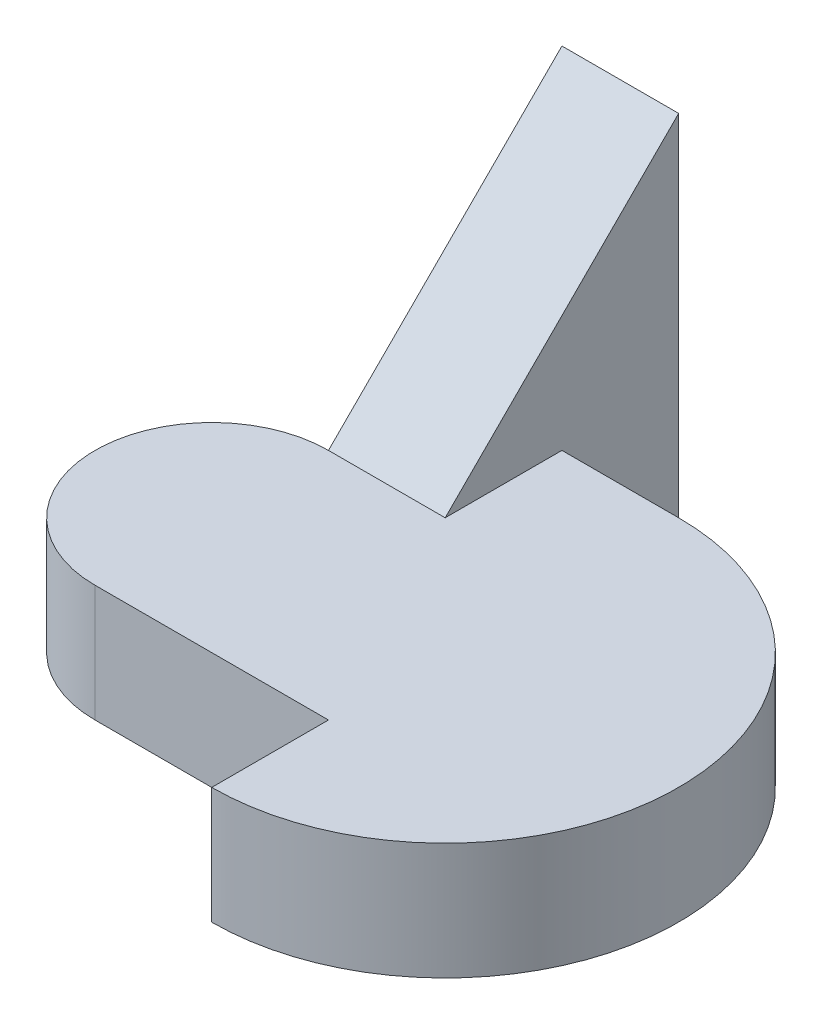
ISO-10303-21;
HEADER;
FILE_DESCRIPTION(('STEP AP214'),'2;1');
FILE_NAME('part.step','',(''),(''),'','','');
FILE_SCHEMA(('AUTOMOTIVE_DESIGN { 1 0 10303 214 1 1 1 1 }'));
ENDSEC;
DATA;
#1=APPLICATION_CONTEXT('core data for automotive mechanical design processes');
#2=APPLICATION_PROTOCOL_DEFINITION('international standard','automotive_design',2000,#1);
#3=PRODUCT_CONTEXT('',#1,'mechanical');
#4=PRODUCT('Part','Part','',(#3));
#5=PRODUCT_RELATED_PRODUCT_CATEGORY('part','',(#4));
#6=PRODUCT_DEFINITION_FORMATION('','',#4);
#7=PRODUCT_DEFINITION_CONTEXT('part definition',#1,'design');
#8=PRODUCT_DEFINITION('design','',#6,#7);
#9=PRODUCT_DEFINITION_SHAPE('','',#8);
#10=(LENGTH_UNIT() NAMED_UNIT(*) SI_UNIT(.MILLI.,.METRE.));
#11=(NAMED_UNIT(*) PLANE_ANGLE_UNIT() SI_UNIT($,.RADIAN.));
#12=(NAMED_UNIT(*) SI_UNIT($,.STERADIAN.) SOLID_ANGLE_UNIT());
#13=UNCERTAINTY_MEASURE_WITH_UNIT(LENGTH_MEASURE(1.E-05),#10,'distance_accuracy_value','');
#14=(GEOMETRIC_REPRESENTATION_CONTEXT(3) GLOBAL_UNCERTAINTY_ASSIGNED_CONTEXT((#13)) GLOBAL_UNIT_ASSIGNED_CONTEXT((#10,
#11,#12)) REPRESENTATION_CONTEXT('',''));
#15=CARTESIAN_POINT('',(0.,0.,0.));
#16=DIRECTION('',(0.,0.,1.));
#17=DIRECTION('',(1.,0.,0.));
#18=AXIS2_PLACEMENT_3D('',#15,#16,#17);
#19=CARTESIAN_POINT('',(-20.,10.,0.));
#20=DIRECTION('',(0.,-1.,0.));
#21=DIRECTION('',(0.,0.,-1.));
#22=AXIS2_PLACEMENT_3D('',#19,#20,#21);
#23=CYLINDRICAL_SURFACE('',#22,10.);
#24=CARTESIAN_POINT('',(-20.,0.,0.));
#25=DIRECTION('',(0.,1.,0.));
#26=DIRECTION('',(0.,0.,1.));
#27=AXIS2_PLACEMENT_3D('',#24,#25,#26);
#28=CIRCLE('',#27,10.);
#29=CARTESIAN_POINT('',(-20.,0.,-10.));
#30=VERTEX_POINT('',#29);
#31=CARTESIAN_POINT('',(-20.,0.,10.));
#32=VERTEX_POINT('',#31);
#33=EDGE_CURVE('E130',#30,#32,#28,.T.);
#34=ORIENTED_EDGE('',*,*,#33,.T.);
#35=DIRECTION('',(0.,-1.,0.));
#36=VECTOR('',#35,1.);
#37=CARTESIAN_POINT('',(-20.,10.,10.));
#38=LINE('',#37,#36);
#39=CARTESIAN_POINT('',(-20.,10.,10.));
#40=VERTEX_POINT('',#39);
#41=EDGE_CURVE('E48',#40,#32,#38,.T.);
#42=ORIENTED_EDGE('',*,*,#41,.F.);
#43=CARTESIAN_POINT('',(-20.,10.,0.));
#44=DIRECTION('',(0.,1.,0.));
#45=DIRECTION('',(0.,0.,1.));
#46=AXIS2_PLACEMENT_3D('',#43,#44,#45);
#47=CIRCLE('',#46,10.);
#48=CARTESIAN_POINT('',(-20.,10.,-10.));
#49=VERTEX_POINT('',#48);
#50=EDGE_CURVE('E95',#49,#40,#47,.T.);
#51=ORIENTED_EDGE('',*,*,#50,.F.);
#52=DIRECTION('',(0.,-1.,0.));
#53=VECTOR('',#52,1.);
#54=CARTESIAN_POINT('',(-20.,10.,-10.));
#55=LINE('',#54,#53);
#56=EDGE_CURVE('E11',#49,#30,#55,.T.);
#57=ORIENTED_EDGE('',*,*,#56,.T.);
#58=EDGE_LOOP('',(#34,#42,#51,#57));
#59=FACE_BOUND('',#58,.T.);
#60=ADVANCED_FACE('F39',(#59),#23,.T.);
#61=CARTESIAN_POINT('',(-20.,10.,10.));
#62=DIRECTION('',(0.,0.,-1.));
#63=DIRECTION('',(-1.,0.,0.));
#64=AXIS2_PLACEMENT_3D('',#61,#62,#63);
#65=PLANE('',#64);
#66=DIRECTION('',(1.,0.,0.));
#67=VECTOR('',#66,1.);
#68=CARTESIAN_POINT('',(-20.,0.,10.));
#69=LINE('',#68,#67);
#70=CARTESIAN_POINT('',(0.,0.,10.));
#71=VERTEX_POINT('',#70);
#72=EDGE_CURVE('E133',#32,#71,#69,.T.);
#73=ORIENTED_EDGE('',*,*,#72,.T.);
#74=DIRECTION('',(0.,-1.,0.));
#75=VECTOR('',#74,1.);
#76=CARTESIAN_POINT('',(0.,10.,10.));
#77=LINE('',#76,#75);
#78=CARTESIAN_POINT('',(0.,10.,10.));
#79=VERTEX_POINT('',#78);
#80=EDGE_CURVE('E149',#79,#71,#77,.T.);
#81=ORIENTED_EDGE('',*,*,#80,.F.);
#82=DIRECTION('',(1.,0.,0.));
#83=VECTOR('',#82,1.);
#84=CARTESIAN_POINT('',(-20.,10.,10.));
#85=LINE('',#84,#83);
#86=EDGE_CURVE('E159',#40,#79,#85,.T.);
#87=ORIENTED_EDGE('',*,*,#86,.F.);
#88=ORIENTED_EDGE('',*,*,#41,.T.);
#89=EDGE_LOOP('',(#73,#81,#87,#88));
#90=FACE_BOUND('',#89,.T.);
#91=ADVANCED_FACE('F157',(#90),#65,.F.);
#92=CARTESIAN_POINT('',(0.,10.,10.));
#93=DIRECTION('',(1.,0.,0.));
#94=DIRECTION('',(0.,0.,-1.));
#95=AXIS2_PLACEMENT_3D('',#92,#93,#94);
#96=PLANE('',#95);
#97=DIRECTION('',(0.,0.,1.));
#98=VECTOR('',#97,1.);
#99=CARTESIAN_POINT('',(0.,0.,10.));
#100=LINE('',#99,#98);
#101=CARTESIAN_POINT('',(0.,0.,20.));
#102=VERTEX_POINT('',#101);
#103=EDGE_CURVE('E137',#71,#102,#100,.T.);
#104=ORIENTED_EDGE('',*,*,#103,.T.);
#105=DIRECTION('',(0.,-1.,0.));
#106=VECTOR('',#105,1.);
#107=CARTESIAN_POINT('',(0.,10.,20.));
#108=LINE('',#107,#106);
#109=CARTESIAN_POINT('',(0.,10.,20.));
#110=VERTEX_POINT('',#109);
#111=EDGE_CURVE('E120',#110,#102,#108,.T.);
#112=ORIENTED_EDGE('',*,*,#111,.F.);
#113=DIRECTION('',(0.,0.,1.));
#114=VECTOR('',#113,1.);
#115=CARTESIAN_POINT('',(0.,10.,10.));
#116=LINE('',#115,#114);
#117=EDGE_CURVE('E113',#79,#110,#116,.T.);
#118=ORIENTED_EDGE('',*,*,#117,.F.);
#119=ORIENTED_EDGE('',*,*,#80,.T.);
#120=EDGE_LOOP('',(#104,#112,#118,#119));
#121=FACE_BOUND('',#120,.T.);
#122=ADVANCED_FACE('F165',(#121),#96,.F.);
#123=CARTESIAN_POINT('',(0.,10.,0.));
#124=DIRECTION('',(0.,-1.,0.));
#125=DIRECTION('',(0.,0.,-1.));
#126=AXIS2_PLACEMENT_3D('',#123,#124,#125);
#127=CYLINDRICAL_SURFACE('',#126,20.);
#128=CARTESIAN_POINT('',(0.,0.,0.));
#129=DIRECTION('',(0.,1.,0.));
#130=DIRECTION('',(0.,0.,1.));
#131=AXIS2_PLACEMENT_3D('',#128,#129,#130);
#132=CIRCLE('',#131,20.);
#133=CARTESIAN_POINT('',(0.,0.,-20.));
#134=VERTEX_POINT('',#133);
#135=EDGE_CURVE('E80',#102,#134,#132,.T.);
#136=ORIENTED_EDGE('',*,*,#135,.T.);
#137=DIRECTION('',(0.,-1.,0.));
#138=VECTOR('',#137,1.);
#139=CARTESIAN_POINT('',(0.,10.,-20.));
#140=LINE('',#139,#138);
#141=CARTESIAN_POINT('',(0.,10.,-20.));
#142=VERTEX_POINT('',#141);
#143=EDGE_CURVE('E117',#142,#134,#140,.T.);
#144=ORIENTED_EDGE('',*,*,#143,.F.);
#145=CARTESIAN_POINT('',(0.,10.,0.));
#146=DIRECTION('',(0.,1.,0.));
#147=DIRECTION('',(0.,0.,1.));
#148=AXIS2_PLACEMENT_3D('',#145,#146,#147);
#149=CIRCLE('',#148,20.);
#150=EDGE_CURVE('E108',#110,#142,#149,.T.);
#151=ORIENTED_EDGE('',*,*,#150,.F.);
#152=ORIENTED_EDGE('',*,*,#111,.T.);
#153=EDGE_LOOP('',(#136,#144,#151,#152));
#154=FACE_BOUND('',#153,.T.);
#155=ADVANCED_FACE('F118',(#154),#127,.T.);
#156=CARTESIAN_POINT('',(0.,10.,-20.));
#157=DIRECTION('',(0.,0.,1.));
#158=DIRECTION('',(1.,0.,0.));
#159=AXIS2_PLACEMENT_3D('',#156,#157,#158);
#160=PLANE('',#159);
#161=DIRECTION('',(-1.,0.,0.));
#162=VECTOR('',#161,1.);
#163=CARTESIAN_POINT('',(0.,0.,-20.));
#164=LINE('',#163,#162);
#165=CARTESIAN_POINT('',(-10.,0.,-20.));
#166=VERTEX_POINT('',#165);
#167=EDGE_CURVE('E87',#134,#166,#164,.T.);
#168=ORIENTED_EDGE('',*,*,#167,.T.);
#169=DIRECTION('',(0.,-1.,0.));
#170=VECTOR('',#169,1.);
#171=CARTESIAN_POINT('',(-10.,10.,-20.));
#172=LINE('',#171,#170);
#173=CARTESIAN_POINT('',(-10.,10.,-20.));
#174=VERTEX_POINT('',#173);
#175=EDGE_CURVE('E121',#174,#166,#172,.T.);
#176=ORIENTED_EDGE('',*,*,#175,.F.);
#177=DIRECTION('',(-1.,0.,0.));
#178=VECTOR('',#177,1.);
#179=CARTESIAN_POINT('',(0.,10.,-20.));
#180=LINE('',#179,#178);
#181=EDGE_CURVE('E111',#142,#174,#180,.T.);
#182=ORIENTED_EDGE('',*,*,#181,.F.);
#183=ORIENTED_EDGE('',*,*,#143,.T.);
#184=EDGE_LOOP('',(#168,#176,#182,#183));
#185=FACE_BOUND('',#184,.T.);
#186=ADVANCED_FACE('F123',(#185),#160,.F.);
#187=CARTESIAN_POINT('',(-20.,10.,0.));
#188=DIRECTION('',(0.,1.,0.));
#189=DIRECTION('',(0.,0.,1.));
#190=AXIS2_PLACEMENT_3D('',#187,#188,#189);
#191=PLANE('',#190);
#192=DIRECTION('',(-1.,0.,0.));
#193=VECTOR('',#192,1.);
#194=CARTESIAN_POINT('',(-10.,10.,-10.));
#195=LINE('',#194,#193);
#196=CARTESIAN_POINT('',(-10.,10.,-10.));
#197=VERTEX_POINT('',#196);
#198=EDGE_CURVE('E144',#197,#49,#195,.T.);
#199=ORIENTED_EDGE('',*,*,#198,.T.);
#200=ORIENTED_EDGE('',*,*,#50,.T.);
#201=ORIENTED_EDGE('',*,*,#86,.T.);
#202=ORIENTED_EDGE('',*,*,#117,.T.);
#203=ORIENTED_EDGE('',*,*,#150,.T.);
#204=ORIENTED_EDGE('',*,*,#181,.T.);
#205=DIRECTION('',(0.,0.,1.));
#206=VECTOR('',#205,1.);
#207=CARTESIAN_POINT('',(-10.,10.,-20.));
#208=LINE('',#207,#206);
#209=EDGE_CURVE('E56',#174,#197,#208,.T.);
#210=ORIENTED_EDGE('',*,*,#209,.T.);
#211=EDGE_LOOP('',(#199,#200,#201,#202,#203,#204,#210));
#212=FACE_BOUND('',#211,.T.);
#213=ADVANCED_FACE('F109',(#212),#191,.T.);
#214=CARTESIAN_POINT('',(-20.,0.,0.));
#215=DIRECTION('',(0.,1.,0.));
#216=DIRECTION('',(0.,0.,1.));
#217=AXIS2_PLACEMENT_3D('',#214,#215,#216);
#218=PLANE('',#217);
#219=ORIENTED_EDGE('',*,*,#33,.F.);
#220=DIRECTION('',(0.,0.,1.));
#221=VECTOR('',#220,1.);
#222=CARTESIAN_POINT('',(-20.,0.,-30.));
#223=LINE('',#222,#221);
#224=CARTESIAN_POINT('',(-20.,0.,-30.));
#225=VERTEX_POINT('',#224);
#226=EDGE_CURVE('E181',#225,#30,#223,.T.);
#227=ORIENTED_EDGE('',*,*,#226,.F.);
#228=DIRECTION('',(1.,0.,0.));
#229=VECTOR('',#228,1.);
#230=CARTESIAN_POINT('',(-20.,0.,-30.));
#231=LINE('',#230,#229);
#232=CARTESIAN_POINT('',(-10.,0.,-30.));
#233=VERTEX_POINT('',#232);
#234=EDGE_CURVE('E177',#225,#233,#231,.T.);
#235=ORIENTED_EDGE('',*,*,#234,.T.);
#236=DIRECTION('',(0.,0.,1.));
#237=VECTOR('',#236,1.);
#238=CARTESIAN_POINT('',(-10.,0.,-30.));
#239=LINE('',#238,#237);
#240=EDGE_CURVE('E182',#233,#166,#239,.T.);
#241=ORIENTED_EDGE('',*,*,#240,.T.);
#242=ORIENTED_EDGE('',*,*,#167,.F.);
#243=ORIENTED_EDGE('',*,*,#135,.F.);
#244=ORIENTED_EDGE('',*,*,#103,.F.);
#245=ORIENTED_EDGE('',*,*,#72,.F.);
#246=EDGE_LOOP('',(#219,#227,#235,#241,#242,#243,#244,#245));
#247=FACE_BOUND('',#246,.T.);
#248=ADVANCED_FACE('F162',(#247),#218,.F.);
#249=CARTESIAN_POINT('',(-9.99999999999999,0.,0.));
#250=DIRECTION('',(-1.,0.,0.));
#251=DIRECTION('',(0.,0.,1.));
#252=AXIS2_PLACEMENT_3D('',#249,#250,#251);
#253=PLANE('',#252);
#254=ORIENTED_EDGE('',*,*,#209,.F.);
#255=ORIENTED_EDGE('',*,*,#175,.T.);
#256=ORIENTED_EDGE('',*,*,#240,.F.);
#257=DIRECTION('',(0.,-1.,0.));
#258=VECTOR('',#257,1.);
#259=CARTESIAN_POINT('',(-10.,30.,-30.));
#260=LINE('',#259,#258);
#261=CARTESIAN_POINT('',(-10.,30.,-30.));
#262=VERTEX_POINT('',#261);
#263=EDGE_CURVE('E187',#262,#233,#260,.T.);
#264=ORIENTED_EDGE('',*,*,#263,.F.);
#265=DIRECTION('',(0.,0.707106781186547,-0.707106781186548));
#266=VECTOR('',#265,1.);
#267=CARTESIAN_POINT('',(-10.,10.,-10.));
#268=LINE('',#267,#266);
#269=EDGE_CURVE('E191',#197,#262,#268,.T.);
#270=ORIENTED_EDGE('',*,*,#269,.F.);
#271=EDGE_LOOP('',(#254,#255,#256,#264,#270));
#272=FACE_BOUND('',#271,.T.);
#273=ADVANCED_FACE('F223',(#272),#253,.F.);
#274=CARTESIAN_POINT('',(-20.,10.,-10.));
#275=DIRECTION('',(0.,-0.707106781186548,-0.707106781186547));
#276=DIRECTION('',(0.,0.707106781186547,-0.707106781186548));
#277=AXIS2_PLACEMENT_3D('',#274,#275,#276);
#278=PLANE('',#277);
#279=ORIENTED_EDGE('',*,*,#269,.T.);
#280=DIRECTION('',(1.,0.,0.));
#281=VECTOR('',#280,1.);
#282=CARTESIAN_POINT('',(-20.,30.,-30.));
#283=LINE('',#282,#281);
#284=CARTESIAN_POINT('',(-20.,30.,-30.));
#285=VERTEX_POINT('',#284);
#286=EDGE_CURVE('E134',#285,#262,#283,.T.);
#287=ORIENTED_EDGE('',*,*,#286,.F.);
#288=DIRECTION('',(0.,0.707106781186547,-0.707106781186548));
#289=VECTOR('',#288,1.);
#290=CARTESIAN_POINT('',(-20.,10.,-10.));
#291=LINE('',#290,#289);
#292=EDGE_CURVE('E186',#49,#285,#291,.T.);
#293=ORIENTED_EDGE('',*,*,#292,.F.);
#294=ORIENTED_EDGE('',*,*,#198,.F.);
#295=EDGE_LOOP('',(#279,#287,#293,#294));
#296=FACE_BOUND('',#295,.T.);
#297=ADVANCED_FACE('F214',(#296),#278,.F.);
#298=CARTESIAN_POINT('',(-20.,30.,-30.));
#299=DIRECTION('',(0.,0.,1.));
#300=DIRECTION('',(1.,0.,0.));
#301=AXIS2_PLACEMENT_3D('',#298,#299,#300);
#302=PLANE('',#301);
#303=ORIENTED_EDGE('',*,*,#263,.T.);
#304=ORIENTED_EDGE('',*,*,#234,.F.);
#305=DIRECTION('',(0.,-1.,0.));
#306=VECTOR('',#305,1.);
#307=CARTESIAN_POINT('',(-20.,30.,-30.));
#308=LINE('',#307,#306);
#309=EDGE_CURVE('E198',#285,#225,#308,.T.);
#310=ORIENTED_EDGE('',*,*,#309,.F.);
#311=ORIENTED_EDGE('',*,*,#286,.T.);
#312=EDGE_LOOP('',(#303,#304,#310,#311));
#313=FACE_BOUND('',#312,.T.);
#314=ADVANCED_FACE('F218',(#313),#302,.F.);
#315=CARTESIAN_POINT('',(-20.,0.,0.));
#316=DIRECTION('',(-1.,0.,0.));
#317=DIRECTION('',(0.,0.,1.));
#318=AXIS2_PLACEMENT_3D('',#315,#316,#317);
#319=PLANE('',#318);
#320=ORIENTED_EDGE('',*,*,#292,.T.);
#321=ORIENTED_EDGE('',*,*,#309,.T.);
#322=ORIENTED_EDGE('',*,*,#226,.T.);
#323=ORIENTED_EDGE('',*,*,#56,.F.);
#324=EDGE_LOOP('',(#320,#321,#322,#323));
#325=FACE_BOUND('',#324,.T.);
#326=ADVANCED_FACE('F209',(#325),#319,.T.);
#327=CLOSED_SHELL('',(#60,#91,#122,#155,#186,#213,#248,#273,#297,#314,#326));
#328=MANIFOLD_SOLID_BREP('B2',#327);
#329=ADVANCED_BREP_SHAPE_REPRESENTATION('',(#18,#328),#14);
#330=SHAPE_DEFINITION_REPRESENTATION(#9,#329);
ENDSEC;
END-ISO-10303-21;
